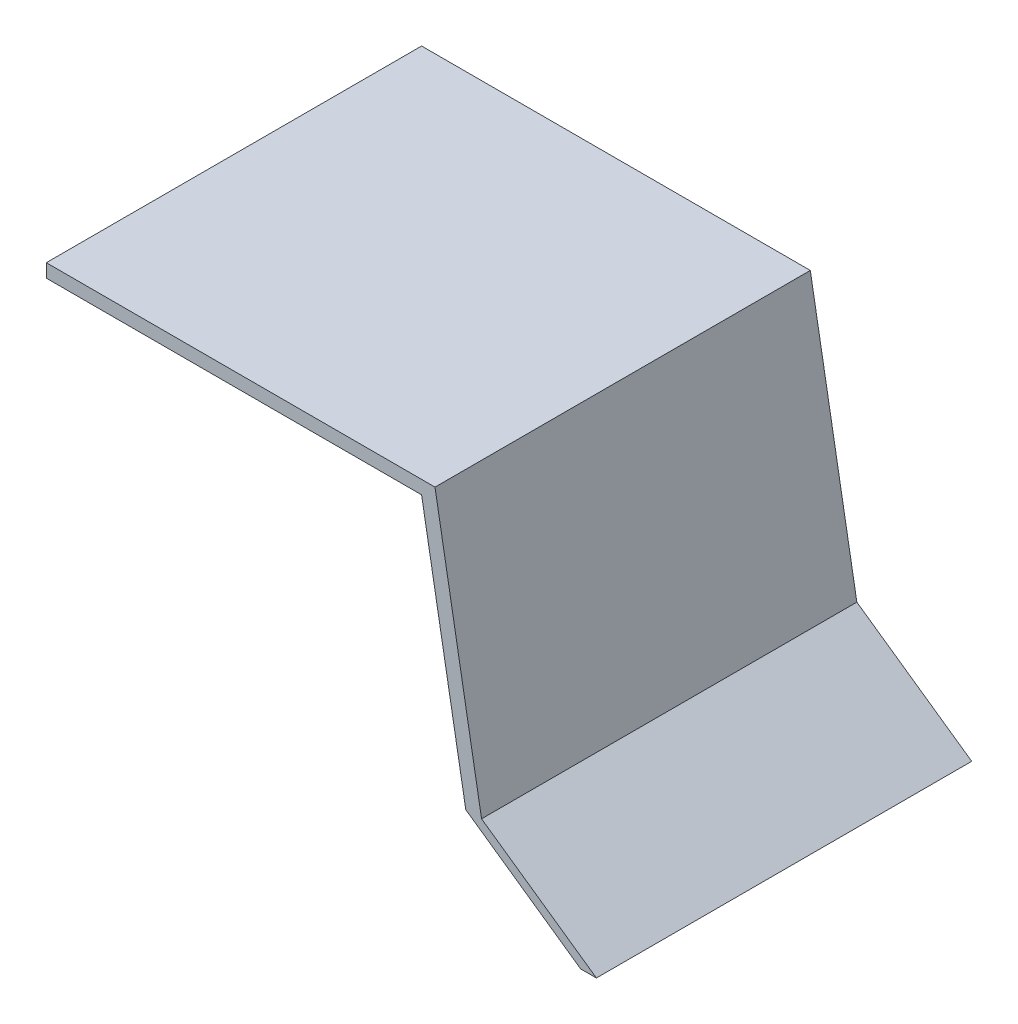
ISO-10303-21;
HEADER;
FILE_DESCRIPTION(('STEP AP214'),'2;1');
FILE_NAME('part.step','',(''),(''),'','','');
FILE_SCHEMA(('AUTOMOTIVE_DESIGN { 1 0 10303 214 1 1 1 1 }'));
ENDSEC;
DATA;
#1=APPLICATION_CONTEXT('core data for automotive mechanical design processes');
#2=APPLICATION_PROTOCOL_DEFINITION('international standard','automotive_design',2000,#1);
#3=PRODUCT_CONTEXT('',#1,'mechanical');
#4=PRODUCT('Part','Part','',(#3));
#5=PRODUCT_RELATED_PRODUCT_CATEGORY('part','',(#4));
#6=PRODUCT_DEFINITION_FORMATION('','',#4);
#7=PRODUCT_DEFINITION_CONTEXT('part definition',#1,'design');
#8=PRODUCT_DEFINITION('design','',#6,#7);
#9=PRODUCT_DEFINITION_SHAPE('','',#8);
#10=(LENGTH_UNIT() NAMED_UNIT(*) SI_UNIT(.MILLI.,.METRE.));
#11=(NAMED_UNIT(*) PLANE_ANGLE_UNIT() SI_UNIT($,.RADIAN.));
#12=(NAMED_UNIT(*) SI_UNIT($,.STERADIAN.) SOLID_ANGLE_UNIT());
#13=UNCERTAINTY_MEASURE_WITH_UNIT(LENGTH_MEASURE(1.E-05),#10,'distance_accuracy_value','');
#14=(GEOMETRIC_REPRESENTATION_CONTEXT(3) GLOBAL_UNCERTAINTY_ASSIGNED_CONTEXT((#13)) GLOBAL_UNIT_ASSIGNED_CONTEXT((#10,
#11,#12)) REPRESENTATION_CONTEXT('',''));
#15=CARTESIAN_POINT('',(0.,0.,0.));
#16=DIRECTION('',(0.,0.,1.));
#17=DIRECTION('',(1.,0.,0.));
#18=AXIS2_PLACEMENT_3D('',#15,#16,#17);
#19=CARTESIAN_POINT('',(0.,0.,0.));
#20=DIRECTION('',(0.,1.,0.));
#21=DIRECTION('',(0.,0.,1.));
#22=AXIS2_PLACEMENT_3D('',#19,#20,#21);
#23=PLANE('',#22);
#24=DIRECTION('',(0.,0.,1.));
#25=VECTOR('',#24,1.);
#26=CARTESIAN_POINT('',(190.5,0.,-158.75));
#27=LINE('',#26,#25);
#28=CARTESIAN_POINT('',(190.5,0.,-171.45));
#29=VERTEX_POINT('',#28);
#30=CARTESIAN_POINT('',(190.5,0.,-158.75));
#31=VERTEX_POINT('',#30);
#32=EDGE_CURVE('E214',#29,#31,#27,.T.);
#33=ORIENTED_EDGE('',*,*,#32,.F.);
#34=DIRECTION('',(-1.,0.,0.));
#35=VECTOR('',#34,1.);
#36=CARTESIAN_POINT('',(190.5,0.,-171.45));
#37=LINE('',#36,#35);
#38=CARTESIAN_POINT('',(165.1,0.,-171.45));
#39=VERTEX_POINT('',#38);
#40=EDGE_CURVE('E232',#29,#39,#37,.T.);
#41=ORIENTED_EDGE('',*,*,#40,.T.);
#42=DIRECTION('',(0.,0.,1.));
#43=VECTOR('',#42,1.);
#44=CARTESIAN_POINT('',(165.1,0.,-158.75));
#45=LINE('',#44,#43);
#46=CARTESIAN_POINT('',(165.1,0.,-158.75));
#47=VERTEX_POINT('',#46);
#48=EDGE_CURVE('E176',#39,#47,#45,.T.);
#49=ORIENTED_EDGE('',*,*,#48,.T.);
#50=DIRECTION('',(-1.,0.,0.));
#51=VECTOR('',#50,1.);
#52=CARTESIAN_POINT('',(190.5,0.,-158.75));
#53=LINE('',#52,#51);
#54=EDGE_CURVE('E66',#31,#47,#53,.T.);
#55=ORIENTED_EDGE('',*,*,#54,.F.);
#56=EDGE_LOOP('',(#33,#41,#49,#55));
#57=FACE_BOUND('',#56,.T.);
#58=DIRECTION('',(1.,0.,0.));
#59=VECTOR('',#58,1.);
#60=CARTESIAN_POINT('',(0.,0.,0.));
#61=LINE('',#60,#59);
#62=CARTESIAN_POINT('',(0.,0.,0.));
#63=VERTEX_POINT('',#62);
#64=CARTESIAN_POINT('',(355.6,0.,0.));
#65=VERTEX_POINT('',#64);
#66=EDGE_CURVE('E267',#63,#65,#61,.T.);
#67=ORIENTED_EDGE('',*,*,#66,.F.);
#68=DIRECTION('',(0.,0.,-1.));
#69=VECTOR('',#68,1.);
#70=CARTESIAN_POINT('',(0.,0.,0.));
#71=LINE('',#70,#69);
#72=CARTESIAN_POINT('',(0.,0.,-355.6));
#73=VERTEX_POINT('',#72);
#74=EDGE_CURVE('E168',#63,#73,#71,.T.);
#75=ORIENTED_EDGE('',*,*,#74,.T.);
#76=DIRECTION('',(1.,0.,0.));
#77=VECTOR('',#76,1.);
#78=CARTESIAN_POINT('',(0.,0.,-355.6));
#79=LINE('',#78,#77);
#80=CARTESIAN_POINT('',(355.6,0.,-355.6));
#81=VERTEX_POINT('',#80);
#82=EDGE_CURVE('E275',#73,#81,#79,.T.);
#83=ORIENTED_EDGE('',*,*,#82,.T.);
#84=DIRECTION('',(0.,0.,-1.));
#85=VECTOR('',#84,1.);
#86=CARTESIAN_POINT('',(355.6,0.,0.));
#87=LINE('',#86,#85);
#88=EDGE_CURVE('E272',#65,#81,#87,.T.);
#89=ORIENTED_EDGE('',*,*,#88,.F.);
#90=EDGE_LOOP('',(#67,#75,#83,#89));
#91=FACE_BOUND('',#90,.T.);
#92=DIRECTION('',(0.,0.,1.));
#93=VECTOR('',#92,1.);
#94=CARTESIAN_POINT('',(190.5,0.,-196.85));
#95=LINE('',#94,#93);
#96=CARTESIAN_POINT('',(190.5,0.,-196.85));
#97=VERTEX_POINT('',#96);
#98=CARTESIAN_POINT('',(190.5,0.,-184.15));
#99=VERTEX_POINT('',#98);
#100=EDGE_CURVE('E224',#97,#99,#95,.T.);
#101=ORIENTED_EDGE('',*,*,#100,.F.);
#102=DIRECTION('',(-1.,0.,0.));
#103=VECTOR('',#102,1.);
#104=CARTESIAN_POINT('',(190.5,0.,-196.85));
#105=LINE('',#104,#103);
#106=CARTESIAN_POINT('',(165.1,0.,-196.85));
#107=VERTEX_POINT('',#106);
#108=EDGE_CURVE('E258',#97,#107,#105,.T.);
#109=ORIENTED_EDGE('',*,*,#108,.T.);
#110=DIRECTION('',(0.,0.,1.));
#111=VECTOR('',#110,1.);
#112=CARTESIAN_POINT('',(165.1,0.,-196.85));
#113=LINE('',#112,#111);
#114=CARTESIAN_POINT('',(165.1,0.,-184.15));
#115=VERTEX_POINT('',#114);
#116=EDGE_CURVE('E241',#107,#115,#113,.T.);
#117=ORIENTED_EDGE('',*,*,#116,.T.);
#118=DIRECTION('',(-1.,0.,0.));
#119=VECTOR('',#118,1.);
#120=CARTESIAN_POINT('',(190.5,0.,-184.15));
#121=LINE('',#120,#119);
#122=EDGE_CURVE('E256',#99,#115,#121,.T.);
#123=ORIENTED_EDGE('',*,*,#122,.F.);
#124=EDGE_LOOP('',(#101,#109,#117,#123));
#125=FACE_BOUND('',#124,.T.);
#126=ADVANCED_FACE('F43',(#57,#91,#125),#23,.F.);
#127=CARTESIAN_POINT('',(0.,12.7,0.));
#128=DIRECTION('',(0.,0.,-1.));
#129=DIRECTION('',(-1.,0.,0.));
#130=AXIS2_PLACEMENT_3D('',#127,#128,#129);
#131=PLANE('',#130);
#132=ORIENTED_EDGE('',*,*,#66,.T.);
#133=DIRECTION('',(0.173648177666934,-0.984807753012207,0.));
#134=VECTOR('',#133,1.);
#135=CARTESIAN_POINT('',(397.467284472404,-237.441169265101,0.));
#136=LINE('',#135,#134);
#137=CARTESIAN_POINT('',(397.467284472404,-237.441169265101,0.));
#138=VERTEX_POINT('',#137);
#139=EDGE_CURVE('E194',#65,#138,#136,.T.);
#140=ORIENTED_EDGE('',*,*,#139,.T.);
#141=DIRECTION('',(0.819152044288995,-0.573576436351041,0.));
#142=VECTOR('',#141,1.);
#143=CARTESIAN_POINT('',(506.292162586154,-313.641169265101,0.));
#144=LINE('',#143,#142);
#145=CARTESIAN_POINT('',(506.292162586154,-313.641169265101,0.));
#146=VERTEX_POINT('',#145);
#147=EDGE_CURVE('E191',#138,#146,#144,.T.);
#148=ORIENTED_EDGE('',*,*,#147,.T.);
#149=DIRECTION('',(1.,0.,0.));
#150=VECTOR('',#149,1.);
#151=CARTESIAN_POINT('',(521.231515241152,-313.641169265101,0.));
#152=LINE('',#151,#150);
#153=CARTESIAN_POINT('',(521.231515241152,-313.641169265101,0.));
#154=VERTEX_POINT('',#153);
#155=EDGE_CURVE('E187',#146,#154,#152,.T.);
#156=ORIENTED_EDGE('',*,*,#155,.T.);
#157=DIRECTION('',(-0.819152044288995,0.573576436351041,0.));
#158=VECTOR('',#157,1.);
#159=CARTESIAN_POINT('',(412.406637127401,-237.441169265101,0.));
#160=LINE('',#159,#158);
#161=CARTESIAN_POINT('',(412.406637127401,-237.441169265101,0.));
#162=VERTEX_POINT('',#161);
#163=EDGE_CURVE('E181',#154,#162,#160,.T.);
#164=ORIENTED_EDGE('',*,*,#163,.T.);
#165=DIRECTION('',(-0.173648177666934,0.984807753012207,0.));
#166=VECTOR('',#165,1.);
#167=CARTESIAN_POINT('',(368.3,12.7,0.));
#168=LINE('',#167,#166);
#169=CARTESIAN_POINT('',(368.3,12.7,0.));
#170=VERTEX_POINT('',#169);
#171=EDGE_CURVE('E174',#162,#170,#168,.T.);
#172=ORIENTED_EDGE('',*,*,#171,.T.);
#173=DIRECTION('',(1.,0.,0.));
#174=VECTOR('',#173,1.);
#175=CARTESIAN_POINT('',(0.,12.7,0.));
#176=LINE('',#175,#174);
#177=CARTESIAN_POINT('',(0.,12.7,0.));
#178=VERTEX_POINT('',#177);
#179=EDGE_CURVE('E157',#178,#170,#176,.T.);
#180=ORIENTED_EDGE('',*,*,#179,.F.);
#181=DIRECTION('',(0.,-1.,0.));
#182=VECTOR('',#181,1.);
#183=CARTESIAN_POINT('',(0.,12.7,0.));
#184=LINE('',#183,#182);
#185=EDGE_CURVE('E51',#178,#63,#184,.T.);
#186=ORIENTED_EDGE('',*,*,#185,.T.);
#187=EDGE_LOOP('',(#132,#140,#148,#156,#164,#172,#180,#186));
#188=FACE_BOUND('',#187,.T.);
#189=ADVANCED_FACE('F45',(#188),#131,.F.);
#190=CARTESIAN_POINT('',(0.,12.7,-355.6));
#191=DIRECTION('',(0.,0.,-1.));
#192=DIRECTION('',(-1.,0.,0.));
#193=AXIS2_PLACEMENT_3D('',#190,#191,#192);
#194=PLANE('',#193);
#195=ORIENTED_EDGE('',*,*,#82,.F.);
#196=DIRECTION('',(0.,-1.,0.));
#197=VECTOR('',#196,1.);
#198=CARTESIAN_POINT('',(0.,12.7,-355.6));
#199=LINE('',#198,#197);
#200=CARTESIAN_POINT('',(0.,12.7,-355.6));
#201=VERTEX_POINT('',#200);
#202=EDGE_CURVE('E11',#201,#73,#199,.T.);
#203=ORIENTED_EDGE('',*,*,#202,.F.);
#204=DIRECTION('',(1.,0.,0.));
#205=VECTOR('',#204,1.);
#206=CARTESIAN_POINT('',(0.,12.7,-355.6));
#207=LINE('',#206,#205);
#208=CARTESIAN_POINT('',(368.3,12.7,-355.6));
#209=VERTEX_POINT('',#208);
#210=EDGE_CURVE('E167',#201,#209,#207,.T.);
#211=ORIENTED_EDGE('',*,*,#210,.T.);
#212=DIRECTION('',(-0.173648177666934,0.984807753012207,0.));
#213=VECTOR('',#212,1.);
#214=CARTESIAN_POINT('',(368.3,12.7,-355.6));
#215=LINE('',#214,#213);
#216=CARTESIAN_POINT('',(412.406637127401,-237.441169265101,-355.6));
#217=VERTEX_POINT('',#216);
#218=EDGE_CURVE('E175',#217,#209,#215,.T.);
#219=ORIENTED_EDGE('',*,*,#218,.F.);
#220=DIRECTION('',(-0.819152044288995,0.573576436351041,0.));
#221=VECTOR('',#220,1.);
#222=CARTESIAN_POINT('',(412.406637127401,-237.441169265101,-355.6));
#223=LINE('',#222,#221);
#224=CARTESIAN_POINT('',(521.231515241152,-313.641169265101,-355.6));
#225=VERTEX_POINT('',#224);
#226=EDGE_CURVE('E199',#225,#217,#223,.T.);
#227=ORIENTED_EDGE('',*,*,#226,.F.);
#228=DIRECTION('',(1.,0.,0.));
#229=VECTOR('',#228,1.);
#230=CARTESIAN_POINT('',(521.231515241152,-313.641169265101,-355.6));
#231=LINE('',#230,#229);
#232=CARTESIAN_POINT('',(506.292162586154,-313.641169265101,-355.6));
#233=VERTEX_POINT('',#232);
#234=EDGE_CURVE('E203',#233,#225,#231,.T.);
#235=ORIENTED_EDGE('',*,*,#234,.F.);
#236=DIRECTION('',(0.819152044288995,-0.573576436351041,0.));
#237=VECTOR('',#236,1.);
#238=CARTESIAN_POINT('',(506.292162586154,-313.641169265101,-355.6));
#239=LINE('',#238,#237);
#240=CARTESIAN_POINT('',(397.467284472404,-237.441169265101,-355.6));
#241=VERTEX_POINT('',#240);
#242=EDGE_CURVE('E207',#241,#233,#239,.T.);
#243=ORIENTED_EDGE('',*,*,#242,.F.);
#244=DIRECTION('',(0.173648177666934,-0.984807753012207,0.));
#245=VECTOR('',#244,1.);
#246=CARTESIAN_POINT('',(397.467284472404,-237.441169265101,-355.6));
#247=LINE('',#246,#245);
#248=EDGE_CURVE('E182',#81,#241,#247,.T.);
#249=ORIENTED_EDGE('',*,*,#248,.F.);
#250=EDGE_LOOP('',(#195,#203,#211,#219,#227,#235,#243,#249));
#251=FACE_BOUND('',#250,.T.);
#252=ADVANCED_FACE('F289',(#251),#194,.T.);
#253=CARTESIAN_POINT('',(0.,12.7,0.));
#254=DIRECTION('',(-1.,0.,0.));
#255=DIRECTION('',(0.,0.,1.));
#256=AXIS2_PLACEMENT_3D('',#253,#254,#255);
#257=PLANE('',#256);
#258=ORIENTED_EDGE('',*,*,#74,.F.);
#259=ORIENTED_EDGE('',*,*,#185,.F.);
#260=DIRECTION('',(0.,0.,-1.));
#261=VECTOR('',#260,1.);
#262=CARTESIAN_POINT('',(0.,12.7,0.));
#263=LINE('',#262,#261);
#264=EDGE_CURVE('E164',#178,#201,#263,.T.);
#265=ORIENTED_EDGE('',*,*,#264,.T.);
#266=ORIENTED_EDGE('',*,*,#202,.T.);
#267=EDGE_LOOP('',(#258,#259,#265,#266));
#268=FACE_BOUND('',#267,.T.);
#269=ADVANCED_FACE('F285',(#268),#257,.T.);
#270=CARTESIAN_POINT('',(0.,12.7,0.));
#271=DIRECTION('',(0.,1.,0.));
#272=DIRECTION('',(0.,0.,1.));
#273=AXIS2_PLACEMENT_3D('',#270,#271,#272);
#274=PLANE('',#273);
#275=ORIENTED_EDGE('',*,*,#179,.T.);
#276=DIRECTION('',(0.,0.,1.));
#277=VECTOR('',#276,1.);
#278=CARTESIAN_POINT('',(368.3,12.7,-721.567700211908));
#279=LINE('',#278,#277);
#280=EDGE_CURVE('E161',#209,#170,#279,.T.);
#281=ORIENTED_EDGE('',*,*,#280,.F.);
#282=ORIENTED_EDGE('',*,*,#210,.F.);
#283=ORIENTED_EDGE('',*,*,#264,.F.);
#284=EDGE_LOOP('',(#275,#281,#282,#283));
#285=FACE_BOUND('',#284,.T.);
#286=ADVANCED_FACE('F159',(#285),#274,.T.);
#287=CARTESIAN_POINT('',(190.5,0.,-158.75));
#288=DIRECTION('',(0.,0.,-1.));
#289=DIRECTION('',(-1.,0.,0.));
#290=AXIS2_PLACEMENT_3D('',#287,#288,#289);
#291=PLANE('',#290);
#292=DIRECTION('',(0.,-1.,0.));
#293=VECTOR('',#292,1.);
#294=CARTESIAN_POINT('',(165.1,0.,-158.75));
#295=LINE('',#294,#293);
#296=CARTESIAN_POINT('',(165.1,-15.,-158.75));
#297=VERTEX_POINT('',#296);
#298=EDGE_CURVE('E235',#47,#297,#295,.T.);
#299=ORIENTED_EDGE('',*,*,#298,.T.);
#300=DIRECTION('',(-1.,0.,0.));
#301=VECTOR('',#300,1.);
#302=CARTESIAN_POINT('',(190.5,-15.,-158.75));
#303=LINE('',#302,#301);
#304=CARTESIAN_POINT('',(190.5,-15.,-158.75));
#305=VERTEX_POINT('',#304);
#306=EDGE_CURVE('E264',#305,#297,#303,.T.);
#307=ORIENTED_EDGE('',*,*,#306,.F.);
#308=DIRECTION('',(0.,-1.,0.));
#309=VECTOR('',#308,1.);
#310=CARTESIAN_POINT('',(190.5,0.,-158.75));
#311=LINE('',#310,#309);
#312=EDGE_CURVE('E217',#31,#305,#311,.T.);
#313=ORIENTED_EDGE('',*,*,#312,.F.);
#314=ORIENTED_EDGE('',*,*,#54,.T.);
#315=EDGE_LOOP('',(#299,#307,#313,#314));
#316=FACE_BOUND('',#315,.T.);
#317=ADVANCED_FACE('F338',(#316),#291,.F.);
#318=CARTESIAN_POINT('',(190.5,-15.,-177.8));
#319=DIRECTION('',(-1.,0.,0.));
#320=DIRECTION('',(0.,0.,1.));
#321=AXIS2_PLACEMENT_3D('',#318,#319,#320);
#322=CYLINDRICAL_SURFACE('',#321,19.05);
#323=CARTESIAN_POINT('',(165.1,-15.,-177.8));
#324=DIRECTION('',(1.,0.,0.));
#325=DIRECTION('',(0.,0.,-1.));
#326=AXIS2_PLACEMENT_3D('',#323,#324,#325);
#327=CIRCLE('',#326,19.05);
#328=CARTESIAN_POINT('',(165.1,-15.,-196.85));
#329=VERTEX_POINT('',#328);
#330=EDGE_CURVE('E237',#297,#329,#327,.T.);
#331=ORIENTED_EDGE('',*,*,#330,.T.);
#332=DIRECTION('',(-1.,0.,0.));
#333=VECTOR('',#332,1.);
#334=CARTESIAN_POINT('',(190.5,-15.,-196.85));
#335=LINE('',#334,#333);
#336=CARTESIAN_POINT('',(190.5,-15.,-196.85));
#337=VERTEX_POINT('',#336);
#338=EDGE_CURVE('E261',#337,#329,#335,.T.);
#339=ORIENTED_EDGE('',*,*,#338,.F.);
#340=CARTESIAN_POINT('',(190.5,-15.,-177.8));
#341=DIRECTION('',(1.,0.,0.));
#342=DIRECTION('',(0.,0.,-1.));
#343=AXIS2_PLACEMENT_3D('',#340,#341,#342);
#344=CIRCLE('',#343,19.05);
#345=EDGE_CURVE('E220',#305,#337,#344,.T.);
#346=ORIENTED_EDGE('',*,*,#345,.F.);
#347=ORIENTED_EDGE('',*,*,#306,.T.);
#348=EDGE_LOOP('',(#331,#339,#346,#347));
#349=FACE_BOUND('',#348,.T.);
#350=ADVANCED_FACE('F344',(#349),#322,.T.);
#351=CARTESIAN_POINT('',(190.5,-15.,-196.85));
#352=DIRECTION('',(0.,0.,1.));
#353=DIRECTION('',(1.,0.,0.));
#354=AXIS2_PLACEMENT_3D('',#351,#352,#353);
#355=PLANE('',#354);
#356=DIRECTION('',(0.,1.,0.));
#357=VECTOR('',#356,1.);
#358=CARTESIAN_POINT('',(165.1,-15.,-196.85));
#359=LINE('',#358,#357);
#360=EDGE_CURVE('E239',#329,#107,#359,.T.);
#361=ORIENTED_EDGE('',*,*,#360,.T.);
#362=ORIENTED_EDGE('',*,*,#108,.F.);
#363=DIRECTION('',(0.,1.,0.));
#364=VECTOR('',#363,1.);
#365=CARTESIAN_POINT('',(190.5,-15.,-196.85));
#366=LINE('',#365,#364);
#367=EDGE_CURVE('E222',#337,#97,#366,.T.);
#368=ORIENTED_EDGE('',*,*,#367,.F.);
#369=ORIENTED_EDGE('',*,*,#338,.T.);
#370=EDGE_LOOP('',(#361,#362,#368,#369));
#371=FACE_BOUND('',#370,.T.);
#372=ADVANCED_FACE('F350',(#371),#355,.F.);
#373=CARTESIAN_POINT('',(190.5,0.,-184.15));
#374=DIRECTION('',(0.,0.,-1.));
#375=DIRECTION('',(-1.,0.,0.));
#376=AXIS2_PLACEMENT_3D('',#373,#374,#375);
#377=PLANE('',#376);
#378=DIRECTION('',(0.,-1.,0.));
#379=VECTOR('',#378,1.);
#380=CARTESIAN_POINT('',(165.1,0.,-184.15));
#381=LINE('',#380,#379);
#382=CARTESIAN_POINT('',(165.1,-14.9999999999999,-184.15));
#383=VERTEX_POINT('',#382);
#384=EDGE_CURVE('E58',#115,#383,#381,.T.);
#385=ORIENTED_EDGE('',*,*,#384,.T.);
#386=DIRECTION('',(-1.,0.,0.));
#387=VECTOR('',#386,1.);
#388=CARTESIAN_POINT('',(190.5,-14.9999999999999,-184.15));
#389=LINE('',#388,#387);
#390=CARTESIAN_POINT('',(190.5,-14.9999999999999,-184.15));
#391=VERTEX_POINT('',#390);
#392=EDGE_CURVE('E253',#391,#383,#389,.T.);
#393=ORIENTED_EDGE('',*,*,#392,.F.);
#394=DIRECTION('',(0.,-1.,0.));
#395=VECTOR('',#394,1.);
#396=CARTESIAN_POINT('',(190.5,0.,-184.15));
#397=LINE('',#396,#395);
#398=EDGE_CURVE('E226',#99,#391,#397,.T.);
#399=ORIENTED_EDGE('',*,*,#398,.F.);
#400=ORIENTED_EDGE('',*,*,#122,.T.);
#401=EDGE_LOOP('',(#385,#393,#399,#400));
#402=FACE_BOUND('',#401,.T.);
#403=ADVANCED_FACE('F358',(#402),#377,.F.);
#404=CARTESIAN_POINT('',(190.5,-14.9999999999999,-177.8));
#405=DIRECTION('',(-1.,0.,0.));
#406=DIRECTION('',(0.,0.,1.));
#407=AXIS2_PLACEMENT_3D('',#404,#405,#406);
#408=CYLINDRICAL_SURFACE('',#407,6.34999999999999);
#409=CARTESIAN_POINT('',(165.1,-14.9999999999999,-177.8));
#410=DIRECTION('',(-1.,0.,0.));
#411=DIRECTION('',(0.,0.,1.));
#412=AXIS2_PLACEMENT_3D('',#409,#410,#411);
#413=CIRCLE('',#412,6.34999999999999);
#414=CARTESIAN_POINT('',(165.1,-14.9999999999999,-171.45));
#415=VERTEX_POINT('',#414);
#416=EDGE_CURVE('E245',#383,#415,#413,.T.);
#417=ORIENTED_EDGE('',*,*,#416,.T.);
#418=DIRECTION('',(-1.,0.,0.));
#419=VECTOR('',#418,1.);
#420=CARTESIAN_POINT('',(190.5,-14.9999999999999,-171.45));
#421=LINE('',#420,#419);
#422=CARTESIAN_POINT('',(190.5,-14.9999999999999,-171.45));
#423=VERTEX_POINT('',#422);
#424=EDGE_CURVE('E250',#423,#415,#421,.T.);
#425=ORIENTED_EDGE('',*,*,#424,.F.);
#426=CARTESIAN_POINT('',(190.5,-14.9999999999999,-177.8));
#427=DIRECTION('',(-1.,0.,0.));
#428=DIRECTION('',(0.,0.,1.));
#429=AXIS2_PLACEMENT_3D('',#426,#427,#428);
#430=CIRCLE('',#429,6.34999999999999);
#431=EDGE_CURVE('E228',#391,#423,#430,.T.);
#432=ORIENTED_EDGE('',*,*,#431,.F.);
#433=ORIENTED_EDGE('',*,*,#392,.T.);
#434=EDGE_LOOP('',(#417,#425,#432,#433));
#435=FACE_BOUND('',#434,.T.);
#436=ADVANCED_FACE('F366',(#435),#408,.F.);
#437=CARTESIAN_POINT('',(190.5,0.,-171.45));
#438=DIRECTION('',(0.,0.,1.));
#439=DIRECTION('',(1.,0.,0.));
#440=AXIS2_PLACEMENT_3D('',#437,#438,#439);
#441=PLANE('',#440);
#442=DIRECTION('',(0.,1.,0.));
#443=VECTOR('',#442,1.);
#444=CARTESIAN_POINT('',(165.1,0.,-171.45));
#445=LINE('',#444,#443);
#446=EDGE_CURVE('E218',#415,#39,#445,.T.);
#447=ORIENTED_EDGE('',*,*,#446,.T.);
#448=ORIENTED_EDGE('',*,*,#40,.F.);
#449=DIRECTION('',(0.,1.,0.));
#450=VECTOR('',#449,1.);
#451=CARTESIAN_POINT('',(190.5,0.,-171.45));
#452=LINE('',#451,#450);
#453=EDGE_CURVE('E230',#423,#29,#452,.T.);
#454=ORIENTED_EDGE('',*,*,#453,.F.);
#455=ORIENTED_EDGE('',*,*,#424,.T.);
#456=EDGE_LOOP('',(#447,#448,#454,#455));
#457=FACE_BOUND('',#456,.T.);
#458=ADVANCED_FACE('F374',(#457),#441,.F.);
#459=CARTESIAN_POINT('',(190.5,-14.9999999999999,-177.8));
#460=DIRECTION('',(-1.,0.,0.));
#461=DIRECTION('',(0.,0.,1.));
#462=AXIS2_PLACEMENT_3D('',#459,#460,#461);
#463=PLANE('',#462);
#464=ORIENTED_EDGE('',*,*,#32,.T.);
#465=ORIENTED_EDGE('',*,*,#312,.T.);
#466=ORIENTED_EDGE('',*,*,#345,.T.);
#467=ORIENTED_EDGE('',*,*,#367,.T.);
#468=ORIENTED_EDGE('',*,*,#100,.T.);
#469=ORIENTED_EDGE('',*,*,#398,.T.);
#470=ORIENTED_EDGE('',*,*,#431,.T.);
#471=ORIENTED_EDGE('',*,*,#453,.T.);
#472=EDGE_LOOP('',(#464,#465,#466,#467,#468,#469,#470,#471));
#473=FACE_BOUND('',#472,.T.);
#474=ADVANCED_FACE('F382',(#473),#463,.F.);
#475=CARTESIAN_POINT('',(165.1,-14.9999999999999,-177.8));
#476=DIRECTION('',(-1.,0.,0.));
#477=DIRECTION('',(0.,0.,1.));
#478=AXIS2_PLACEMENT_3D('',#475,#476,#477);
#479=PLANE('',#478);
#480=ORIENTED_EDGE('',*,*,#48,.F.);
#481=ORIENTED_EDGE('',*,*,#446,.F.);
#482=ORIENTED_EDGE('',*,*,#416,.F.);
#483=ORIENTED_EDGE('',*,*,#384,.F.);
#484=ORIENTED_EDGE('',*,*,#116,.F.);
#485=ORIENTED_EDGE('',*,*,#360,.F.);
#486=ORIENTED_EDGE('',*,*,#330,.F.);
#487=ORIENTED_EDGE('',*,*,#298,.F.);
#488=EDGE_LOOP('',(#480,#481,#482,#483,#484,#485,#486,#487));
#489=FACE_BOUND('',#488,.T.);
#490=ADVANCED_FACE('F390',(#489),#479,.T.);
#491=CARTESIAN_POINT('',(397.467284472404,-237.441169265101,-721.567700211908));
#492=DIRECTION('',(-0.984807753012207,-0.173648177666934,0.));
#493=DIRECTION('',(0.173648177666934,-0.984807753012207,0.));
#494=AXIS2_PLACEMENT_3D('',#491,#492,#493);
#495=PLANE('',#494);
#496=ORIENTED_EDGE('',*,*,#88,.T.);
#497=ORIENTED_EDGE('',*,*,#248,.T.);
#498=DIRECTION('',(0.,0.,1.));
#499=VECTOR('',#498,1.);
#500=CARTESIAN_POINT('',(397.467284472404,-237.441169265101,-721.567700211908));
#501=LINE('',#500,#499);
#502=EDGE_CURVE('E185',#241,#138,#501,.T.);
#503=ORIENTED_EDGE('',*,*,#502,.T.);
#504=ORIENTED_EDGE('',*,*,#139,.F.);
#505=EDGE_LOOP('',(#496,#497,#503,#504));
#506=FACE_BOUND('',#505,.T.);
#507=ADVANCED_FACE('F292',(#506),#495,.T.);
#508=CARTESIAN_POINT('',(506.292162586154,-313.641169265101,-721.567700211908));
#509=DIRECTION('',(-0.573576436351041,-0.819152044288995,0.));
#510=DIRECTION('',(0.819152044288995,-0.573576436351041,0.));
#511=AXIS2_PLACEMENT_3D('',#508,#509,#510);
#512=PLANE('',#511);
#513=ORIENTED_EDGE('',*,*,#502,.F.);
#514=ORIENTED_EDGE('',*,*,#242,.T.);
#515=DIRECTION('',(0.,0.,1.));
#516=VECTOR('',#515,1.);
#517=CARTESIAN_POINT('',(506.292162586154,-313.641169265101,-721.567700211908));
#518=LINE('',#517,#516);
#519=EDGE_CURVE('E206',#233,#146,#518,.T.);
#520=ORIENTED_EDGE('',*,*,#519,.T.);
#521=ORIENTED_EDGE('',*,*,#147,.F.);
#522=EDGE_LOOP('',(#513,#514,#520,#521));
#523=FACE_BOUND('',#522,.T.);
#524=ADVANCED_FACE('F296',(#523),#512,.T.);
#525=CARTESIAN_POINT('',(521.231515241152,-313.641169265101,-721.567700211908));
#526=DIRECTION('',(0.,-1.,0.));
#527=DIRECTION('',(0.,0.,-1.));
#528=AXIS2_PLACEMENT_3D('',#525,#526,#527);
#529=PLANE('',#528);
#530=ORIENTED_EDGE('',*,*,#519,.F.);
#531=ORIENTED_EDGE('',*,*,#234,.T.);
#532=DIRECTION('',(0.,0.,1.));
#533=VECTOR('',#532,1.);
#534=CARTESIAN_POINT('',(521.231515241152,-313.641169265101,-721.567700211908));
#535=LINE('',#534,#533);
#536=EDGE_CURVE('E202',#225,#154,#535,.T.);
#537=ORIENTED_EDGE('',*,*,#536,.T.);
#538=ORIENTED_EDGE('',*,*,#155,.F.);
#539=EDGE_LOOP('',(#530,#531,#537,#538));
#540=FACE_BOUND('',#539,.T.);
#541=ADVANCED_FACE('F299',(#540),#529,.T.);
#542=CARTESIAN_POINT('',(412.406637127401,-237.441169265101,-721.567700211908));
#543=DIRECTION('',(0.573576436351041,0.819152044288995,0.));
#544=DIRECTION('',(-0.819152044288995,0.573576436351041,0.));
#545=AXIS2_PLACEMENT_3D('',#542,#543,#544);
#546=PLANE('',#545);
#547=ORIENTED_EDGE('',*,*,#536,.F.);
#548=ORIENTED_EDGE('',*,*,#226,.T.);
#549=DIRECTION('',(0.,0.,1.));
#550=VECTOR('',#549,1.);
#551=CARTESIAN_POINT('',(412.406637127401,-237.441169265101,-721.567700211908));
#552=LINE('',#551,#550);
#553=EDGE_CURVE('E198',#217,#162,#552,.T.);
#554=ORIENTED_EDGE('',*,*,#553,.T.);
#555=ORIENTED_EDGE('',*,*,#163,.F.);
#556=EDGE_LOOP('',(#547,#548,#554,#555));
#557=FACE_BOUND('',#556,.T.);
#558=ADVANCED_FACE('F302',(#557),#546,.T.);
#559=CARTESIAN_POINT('',(368.3,12.7,-721.567700211908));
#560=DIRECTION('',(0.984807753012207,0.173648177666934,0.));
#561=DIRECTION('',(-0.173648177666934,0.984807753012207,0.));
#562=AXIS2_PLACEMENT_3D('',#559,#560,#561);
#563=PLANE('',#562);
#564=ORIENTED_EDGE('',*,*,#553,.F.);
#565=ORIENTED_EDGE('',*,*,#218,.T.);
#566=ORIENTED_EDGE('',*,*,#280,.T.);
#567=ORIENTED_EDGE('',*,*,#171,.F.);
#568=EDGE_LOOP('',(#564,#565,#566,#567));
#569=FACE_BOUND('',#568,.T.);
#570=ADVANCED_FACE('F173',(#569),#563,.T.);
#571=CLOSED_SHELL('',(#126,#189,#252,#269,#286,#317,#350,#372,#403,#436,#458,#474,#490,#507,
#524,#541,#558,#570));
#572=MANIFOLD_SOLID_BREP('B2',#571);
#573=ADVANCED_BREP_SHAPE_REPRESENTATION('',(#18,#572),#14);
#574=SHAPE_DEFINITION_REPRESENTATION(#9,#573);
ENDSEC;
END-ISO-10303-21;
